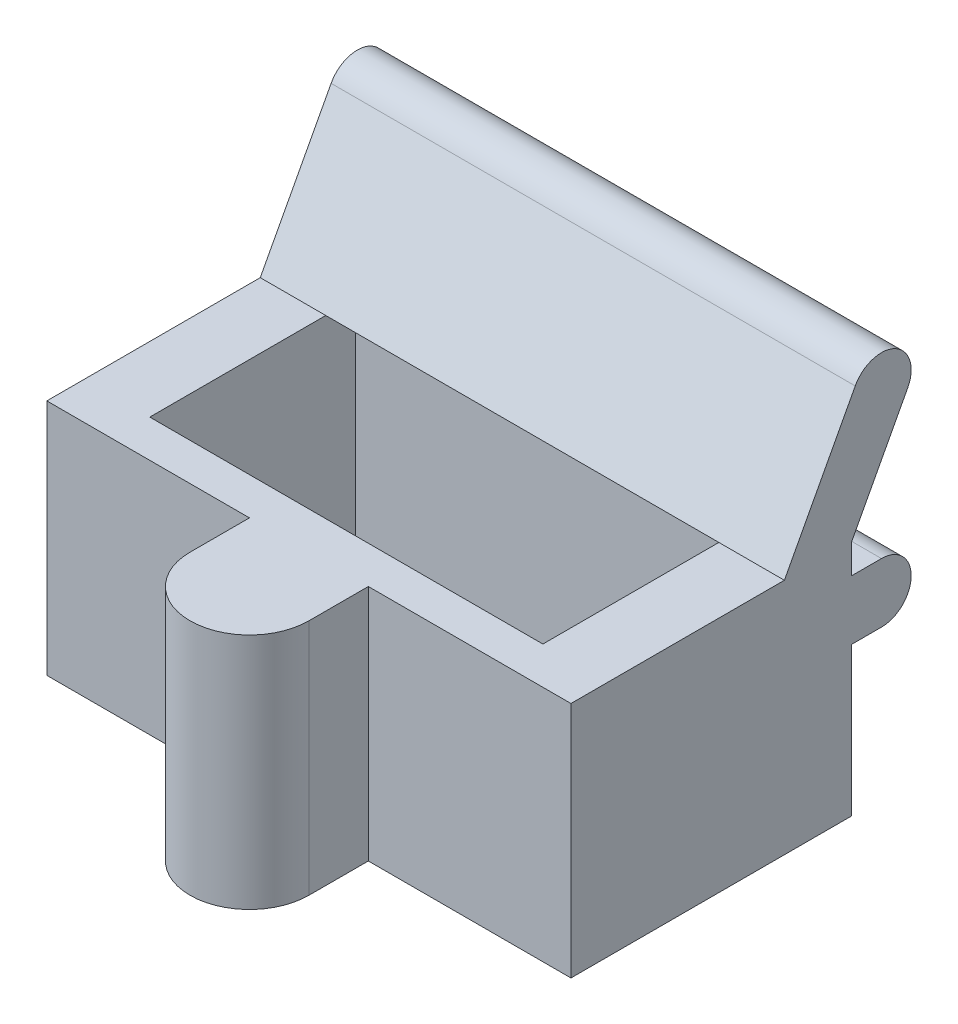
ISO-10303-21;
HEADER;
FILE_DESCRIPTION(('STEP AP214'),'2;1');
FILE_NAME('part.step','',(''),(''),'','','');
FILE_SCHEMA(('AUTOMOTIVE_DESIGN { 1 0 10303 214 1 1 1 1 }'));
ENDSEC;
DATA;
#1=APPLICATION_CONTEXT('core data for automotive mechanical design processes');
#2=APPLICATION_PROTOCOL_DEFINITION('international standard','automotive_design',2000,#1);
#3=PRODUCT_CONTEXT('',#1,'mechanical');
#4=PRODUCT('Part','Part','',(#3));
#5=PRODUCT_RELATED_PRODUCT_CATEGORY('part','',(#4));
#6=PRODUCT_DEFINITION_FORMATION('','',#4);
#7=PRODUCT_DEFINITION_CONTEXT('part definition',#1,'design');
#8=PRODUCT_DEFINITION('design','',#6,#7);
#9=PRODUCT_DEFINITION_SHAPE('','',#8);
#10=(LENGTH_UNIT() NAMED_UNIT(*) SI_UNIT(.MILLI.,.METRE.));
#11=(NAMED_UNIT(*) PLANE_ANGLE_UNIT() SI_UNIT($,.RADIAN.));
#12=(NAMED_UNIT(*) SI_UNIT($,.STERADIAN.) SOLID_ANGLE_UNIT());
#13=UNCERTAINTY_MEASURE_WITH_UNIT(LENGTH_MEASURE(1.E-05),#10,'distance_accuracy_value','');
#14=(GEOMETRIC_REPRESENTATION_CONTEXT(3) GLOBAL_UNCERTAINTY_ASSIGNED_CONTEXT((#13)) GLOBAL_UNIT_ASSIGNED_CONTEXT((#10,
#11,#12)) REPRESENTATION_CONTEXT('',''));
#15=CARTESIAN_POINT('',(0.,0.,0.));
#16=DIRECTION('',(0.,0.,1.));
#17=DIRECTION('',(1.,0.,0.));
#18=AXIS2_PLACEMENT_3D('',#15,#16,#17);
#19=CARTESIAN_POINT('',(0.,25.4,15.));
#20=DIRECTION('',(0.,0.,-1.));
#21=DIRECTION('',(-1.,0.,0.));
#22=AXIS2_PLACEMENT_3D('',#19,#20,#21);
#23=PLANE('',#22);
#24=DIRECTION('',(0.,-1.,0.));
#25=VECTOR('',#24,1.);
#26=CARTESIAN_POINT('',(-6.35,43.3605122421383,15.));
#27=LINE('',#26,#25);
#28=CARTESIAN_POINT('',(-6.35,25.4,15.));
#29=VERTEX_POINT('',#28);
#30=CARTESIAN_POINT('',(-6.35,0.,15.));
#31=VERTEX_POINT('',#30);
#32=EDGE_CURVE('E184',#29,#31,#27,.T.);
#33=ORIENTED_EDGE('',*,*,#32,.F.);
#34=DIRECTION('',(1.,0.,0.));
#35=VECTOR('',#34,1.);
#36=CARTESIAN_POINT('',(0.,25.4,15.));
#37=LINE('',#36,#35);
#38=CARTESIAN_POINT('',(-28.,25.4,15.));
#39=VERTEX_POINT('',#38);
#40=EDGE_CURVE('E194',#39,#29,#37,.T.);
#41=ORIENTED_EDGE('',*,*,#40,.F.);
#42=DIRECTION('',(0.,-1.,0.));
#43=VECTOR('',#42,1.);
#44=CARTESIAN_POINT('',(-28.,25.4,15.));
#45=LINE('',#44,#43);
#46=CARTESIAN_POINT('',(-28.,0.,15.));
#47=VERTEX_POINT('',#46);
#48=EDGE_CURVE('E255',#39,#47,#45,.T.);
#49=ORIENTED_EDGE('',*,*,#48,.T.);
#50=DIRECTION('',(1.,0.,0.));
#51=VECTOR('',#50,1.);
#52=CARTESIAN_POINT('',(0.,0.,15.));
#53=LINE('',#52,#51);
#54=EDGE_CURVE('E196',#47,#31,#53,.T.);
#55=ORIENTED_EDGE('',*,*,#54,.T.);
#56=EDGE_LOOP('',(#33,#41,#49,#55));
#57=FACE_BOUND('',#56,.T.);
#58=ADVANCED_FACE('F39',(#57),#23,.F.);
#59=CARTESIAN_POINT('',(0.,25.4,-15.));
#60=DIRECTION('',(0.,0.,-1.));
#61=DIRECTION('',(-1.,0.,0.));
#62=AXIS2_PLACEMENT_3D('',#59,#60,#61);
#63=PLANE('',#62);
#64=DIRECTION('',(0.,-1.,0.));
#65=VECTOR('',#64,1.);
#66=CARTESIAN_POINT('',(-28.,25.4,-15.));
#67=LINE('',#66,#65);
#68=CARTESIAN_POINT('',(-28.,15.875,-15.));
#69=VERTEX_POINT('',#68);
#70=CARTESIAN_POINT('',(-28.,0.,-15.));
#71=VERTEX_POINT('',#70);
#72=EDGE_CURVE('E256',#69,#71,#67,.T.);
#73=ORIENTED_EDGE('',*,*,#72,.F.);
#74=DIRECTION('',(1.,0.,0.));
#75=VECTOR('',#74,1.);
#76=CARTESIAN_POINT('',(-36.9802561210692,15.875,-15.));
#77=LINE('',#76,#75);
#78=CARTESIAN_POINT('',(28.,15.875,-15.));
#79=VERTEX_POINT('',#78);
#80=EDGE_CURVE('E277',#69,#79,#77,.T.);
#81=ORIENTED_EDGE('',*,*,#80,.T.);
#82=DIRECTION('',(0.,-1.,0.));
#83=VECTOR('',#82,1.);
#84=CARTESIAN_POINT('',(28.,25.4,-15.));
#85=LINE('',#84,#83);
#86=CARTESIAN_POINT('',(28.,0.,-15.));
#87=VERTEX_POINT('',#86);
#88=EDGE_CURVE('E259',#79,#87,#85,.T.);
#89=ORIENTED_EDGE('',*,*,#88,.T.);
#90=DIRECTION('',(1.,0.,0.));
#91=VECTOR('',#90,1.);
#92=CARTESIAN_POINT('',(0.,0.,-15.));
#93=LINE('',#92,#91);
#94=EDGE_CURVE('E224',#71,#87,#93,.T.);
#95=ORIENTED_EDGE('',*,*,#94,.F.);
#96=EDGE_LOOP('',(#73,#81,#89,#95));
#97=FACE_BOUND('',#96,.T.);
#98=ADVANCED_FACE('F274',(#97),#63,.T.);
#99=CARTESIAN_POINT('',(0.,25.4,-11.));
#100=DIRECTION('',(0.,0.,-1.));
#101=DIRECTION('',(-1.,0.,0.));
#102=AXIS2_PLACEMENT_3D('',#99,#100,#101);
#103=PLANE('',#102);
#104=DIRECTION('',(1.,0.,0.));
#105=VECTOR('',#104,1.);
#106=CARTESIAN_POINT('',(0.,0.,-11.));
#107=LINE('',#106,#105);
#108=CARTESIAN_POINT('',(-21.,0.,-11.));
#109=VERTEX_POINT('',#108);
#110=CARTESIAN_POINT('',(21.,0.,-11.));
#111=VERTEX_POINT('',#110);
#112=EDGE_CURVE('E232',#109,#111,#107,.T.);
#113=ORIENTED_EDGE('',*,*,#112,.T.);
#114=DIRECTION('',(0.,-1.,0.));
#115=VECTOR('',#114,1.);
#116=CARTESIAN_POINT('',(21.,25.4,-11.));
#117=LINE('',#116,#115);
#118=CARTESIAN_POINT('',(21.,25.4,-11.));
#119=VERTEX_POINT('',#118);
#120=EDGE_CURVE('E48',#119,#111,#117,.T.);
#121=ORIENTED_EDGE('',*,*,#120,.F.);
#122=DIRECTION('',(1.,0.,0.));
#123=VECTOR('',#122,1.);
#124=CARTESIAN_POINT('',(0.,25.4,-11.));
#125=LINE('',#124,#123);
#126=CARTESIAN_POINT('',(-21.,25.4,-11.));
#127=VERTEX_POINT('',#126);
#128=EDGE_CURVE('E203',#127,#119,#125,.T.);
#129=ORIENTED_EDGE('',*,*,#128,.F.);
#130=DIRECTION('',(0.,-1.,0.));
#131=VECTOR('',#130,1.);
#132=CARTESIAN_POINT('',(-21.,25.4,-11.));
#133=LINE('',#132,#131);
#134=EDGE_CURVE('E245',#127,#109,#133,.T.);
#135=ORIENTED_EDGE('',*,*,#134,.T.);
#136=EDGE_LOOP('',(#113,#121,#129,#135));
#137=FACE_BOUND('',#136,.T.);
#138=ADVANCED_FACE('F377',(#137),#103,.F.);
#139=CARTESIAN_POINT('',(21.,25.4,0.));
#140=DIRECTION('',(1.,0.,0.));
#141=DIRECTION('',(0.,0.,-1.));
#142=AXIS2_PLACEMENT_3D('',#139,#140,#141);
#143=PLANE('',#142);
#144=DIRECTION('',(0.,0.,1.));
#145=VECTOR('',#144,1.);
#146=CARTESIAN_POINT('',(21.,0.,0.));
#147=LINE('',#146,#145);
#148=CARTESIAN_POINT('',(21.,0.,11.));
#149=VERTEX_POINT('',#148);
#150=EDGE_CURVE('E235',#111,#149,#147,.T.);
#151=ORIENTED_EDGE('',*,*,#150,.T.);
#152=DIRECTION('',(0.,-1.,0.));
#153=VECTOR('',#152,1.);
#154=CARTESIAN_POINT('',(21.,25.4,11.));
#155=LINE('',#154,#153);
#156=CARTESIAN_POINT('',(21.,25.4,11.));
#157=VERTEX_POINT('',#156);
#158=EDGE_CURVE('E249',#157,#149,#155,.T.);
#159=ORIENTED_EDGE('',*,*,#158,.F.);
#160=DIRECTION('',(0.,0.,1.));
#161=VECTOR('',#160,1.);
#162=CARTESIAN_POINT('',(21.,25.4,0.));
#163=LINE('',#162,#161);
#164=CARTESIAN_POINT('',(21.,25.4,-7.80333333333333));
#165=VERTEX_POINT('',#164);
#166=EDGE_CURVE('E207',#165,#157,#163,.T.);
#167=ORIENTED_EDGE('',*,*,#166,.F.);
#168=EDGE_CURVE('E212',#119,#165,#163,.T.);
#169=ORIENTED_EDGE('',*,*,#168,.F.);
#170=ORIENTED_EDGE('',*,*,#120,.T.);
#171=EDGE_LOOP('',(#151,#159,#167,#169,#170));
#172=FACE_BOUND('',#171,.T.);
#173=ADVANCED_FACE('F399',(#172),#143,.F.);
#174=CARTESIAN_POINT('',(0.,25.4,11.));
#175=DIRECTION('',(0.,0.,-1.));
#176=DIRECTION('',(-1.,0.,0.));
#177=AXIS2_PLACEMENT_3D('',#174,#175,#176);
#178=PLANE('',#177);
#179=DIRECTION('',(1.,0.,0.));
#180=VECTOR('',#179,1.);
#181=CARTESIAN_POINT('',(0.,0.,11.));
#182=LINE('',#181,#180);
#183=CARTESIAN_POINT('',(-21.,0.,11.));
#184=VERTEX_POINT('',#183);
#185=EDGE_CURVE('E238',#184,#149,#182,.T.);
#186=ORIENTED_EDGE('',*,*,#185,.F.);
#187=DIRECTION('',(0.,-1.,0.));
#188=VECTOR('',#187,1.);
#189=CARTESIAN_POINT('',(-21.,25.4,11.));
#190=LINE('',#189,#188);
#191=CARTESIAN_POINT('',(-21.,25.4,11.));
#192=VERTEX_POINT('',#191);
#193=EDGE_CURVE('E247',#192,#184,#190,.T.);
#194=ORIENTED_EDGE('',*,*,#193,.F.);
#195=DIRECTION('',(1.,0.,0.));
#196=VECTOR('',#195,1.);
#197=CARTESIAN_POINT('',(0.,25.4,11.));
#198=LINE('',#197,#196);
#199=EDGE_CURVE('E215',#192,#157,#198,.T.);
#200=ORIENTED_EDGE('',*,*,#199,.T.);
#201=ORIENTED_EDGE('',*,*,#158,.T.);
#202=EDGE_LOOP('',(#186,#194,#200,#201));
#203=FACE_BOUND('',#202,.T.);
#204=ADVANCED_FACE('F394',(#203),#178,.T.);
#205=CARTESIAN_POINT('',(28.,25.4,0.));
#206=DIRECTION('',(1.,0.,0.));
#207=DIRECTION('',(0.,0.,-1.));
#208=AXIS2_PLACEMENT_3D('',#205,#206,#207);
#209=PLANE('',#208);
#210=DIRECTION('',(0.,0.,1.));
#211=VECTOR('',#210,1.);
#212=CARTESIAN_POINT('',(28.,0.,0.));
#213=LINE('',#212,#211);
#214=CARTESIAN_POINT('',(28.,0.,15.));
#215=VERTEX_POINT('',#214);
#216=EDGE_CURVE('E221',#87,#215,#213,.T.);
#217=ORIENTED_EDGE('',*,*,#216,.F.);
#218=ORIENTED_EDGE('',*,*,#88,.F.);
#219=DIRECTION('',(0.,0.,-1.));
#220=VECTOR('',#219,1.);
#221=CARTESIAN_POINT('',(28.,15.875,-18.175));
#222=LINE('',#221,#220);
#223=CARTESIAN_POINT('',(28.,15.875,-18.175));
#224=VERTEX_POINT('',#223);
#225=EDGE_CURVE('E327',#79,#224,#222,.T.);
#226=ORIENTED_EDGE('',*,*,#225,.T.);
#227=CARTESIAN_POINT('',(28.,19.05,-18.175));
#228=DIRECTION('',(1.,0.,0.));
#229=DIRECTION('',(0.,0.,-1.));
#230=AXIS2_PLACEMENT_3D('',#227,#228,#229);
#231=CIRCLE('',#230,3.175);
#232=CARTESIAN_POINT('',(28.,22.225,-18.175));
#233=VERTEX_POINT('',#232);
#234=EDGE_CURVE('E317',#224,#233,#231,.T.);
#235=ORIENTED_EDGE('',*,*,#234,.T.);
#236=DIRECTION('',(0.,0.,1.));
#237=VECTOR('',#236,1.);
#238=CARTESIAN_POINT('',(28.,22.225,-18.175));
#239=LINE('',#238,#237);
#240=CARTESIAN_POINT('',(28.,22.225,-15.));
#241=VERTEX_POINT('',#240);
#242=EDGE_CURVE('E324',#233,#241,#239,.T.);
#243=ORIENTED_EDGE('',*,*,#242,.T.);
#244=CARTESIAN_POINT('',(28.,25.4,-15.));
#245=VERTEX_POINT('',#244);
#246=EDGE_CURVE('E43',#245,#241,#85,.T.);
#247=ORIENTED_EDGE('',*,*,#246,.F.);
#248=DIRECTION('',(0.,0.88235294117647,-0.470588235294118));
#249=VECTOR('',#248,1.);
#250=CARTESIAN_POINT('',(28.,25.4,-15.));
#251=LINE('',#250,#249);
#252=CARTESIAN_POINT('',(28.,36.6058823529412,-20.9764705882353));
#253=VERTEX_POINT('',#252);
#254=EDGE_CURVE('E296',#245,#253,#251,.T.);
#255=ORIENTED_EDGE('',*,*,#254,.T.);
#256=CARTESIAN_POINT('',(28.,38.1,-18.175));
#257=DIRECTION('',(1.,0.,0.));
#258=DIRECTION('',(0.,0.,-1.));
#259=AXIS2_PLACEMENT_3D('',#256,#257,#258);
#260=CIRCLE('',#259,3.175);
#261=CARTESIAN_POINT('',(28.,39.5941176470588,-15.3735294117647));
#262=VERTEX_POINT('',#261);
#263=EDGE_CURVE('E305',#253,#262,#260,.T.);
#264=ORIENTED_EDGE('',*,*,#263,.T.);
#265=DIRECTION('',(0.,-0.88235294117647,0.470588235294118));
#266=VECTOR('',#265,1.);
#267=CARTESIAN_POINT('',(28.,39.5941176470588,-15.3735294117647));
#268=LINE('',#267,#266);
#269=CARTESIAN_POINT('',(28.,25.4,-7.80333333333333));
#270=VERTEX_POINT('',#269);
#271=EDGE_CURVE('E308',#262,#270,#268,.T.);
#272=ORIENTED_EDGE('',*,*,#271,.T.);
#273=DIRECTION('',(0.,0.,1.));
#274=VECTOR('',#273,1.);
#275=CARTESIAN_POINT('',(28.,25.4,0.));
#276=LINE('',#275,#274);
#277=CARTESIAN_POINT('',(28.,25.4,15.));
#278=VERTEX_POINT('',#277);
#279=EDGE_CURVE('E244',#270,#278,#276,.T.);
#280=ORIENTED_EDGE('',*,*,#279,.T.);
#281=DIRECTION('',(0.,-1.,0.));
#282=VECTOR('',#281,1.);
#283=CARTESIAN_POINT('',(28.,25.4,15.));
#284=LINE('',#283,#282);
#285=EDGE_CURVE('E220',#278,#215,#284,.T.);
#286=ORIENTED_EDGE('',*,*,#285,.T.);
#287=EDGE_LOOP('',(#217,#218,#226,#235,#243,#247,#255,#264,#272,#280,#286));
#288=FACE_BOUND('',#287,.T.);
#289=ADVANCED_FACE('F41',(#288),#209,.T.);
#290=DIRECTION('',(1.,0.,0.));
#291=VECTOR('',#290,1.);
#292=CARTESIAN_POINT('',(-36.9802561210692,22.225,-15.));
#293=LINE('',#292,#291);
#294=CARTESIAN_POINT('',(-28.,22.225,-15.));
#295=VERTEX_POINT('',#294);
#296=EDGE_CURVE('E332',#295,#241,#293,.T.);
#297=ORIENTED_EDGE('',*,*,#296,.F.);
#298=CARTESIAN_POINT('',(-28.,25.4,-15.));
#299=VERTEX_POINT('',#298);
#300=EDGE_CURVE('E257',#299,#295,#67,.T.);
#301=ORIENTED_EDGE('',*,*,#300,.F.);
#302=DIRECTION('',(1.,0.,0.));
#303=VECTOR('',#302,1.);
#304=CARTESIAN_POINT('',(0.,25.4,-15.));
#305=LINE('',#304,#303);
#306=EDGE_CURVE('E337',#299,#245,#305,.T.);
#307=ORIENTED_EDGE('',*,*,#306,.T.);
#308=ORIENTED_EDGE('',*,*,#246,.T.);
#309=EDGE_LOOP('',(#297,#301,#307,#308));
#310=FACE_BOUND('',#309,.T.);
#311=ADVANCED_FACE('F342',(#310),#63,.T.);
#312=CARTESIAN_POINT('',(-28.,25.4,0.));
#313=DIRECTION('',(1.,0.,0.));
#314=DIRECTION('',(0.,0.,-1.));
#315=AXIS2_PLACEMENT_3D('',#312,#313,#314);
#316=PLANE('',#315);
#317=DIRECTION('',(0.,0.,1.));
#318=VECTOR('',#317,1.);
#319=CARTESIAN_POINT('',(-28.,0.,0.));
#320=LINE('',#319,#318);
#321=EDGE_CURVE('E228',#71,#47,#320,.T.);
#322=ORIENTED_EDGE('',*,*,#321,.T.);
#323=ORIENTED_EDGE('',*,*,#48,.F.);
#324=DIRECTION('',(0.,0.,1.));
#325=VECTOR('',#324,1.);
#326=CARTESIAN_POINT('',(-28.,25.4,0.));
#327=LINE('',#326,#325);
#328=CARTESIAN_POINT('',(-28.,25.4,-7.80333333333333));
#329=VERTEX_POINT('',#328);
#330=EDGE_CURVE('E201',#329,#39,#327,.T.);
#331=ORIENTED_EDGE('',*,*,#330,.F.);
#332=DIRECTION('',(0.,0.88235294117647,-0.470588235294118));
#333=VECTOR('',#332,1.);
#334=CARTESIAN_POINT('',(-28.,39.5941176470588,-15.3735294117647));
#335=LINE('',#334,#333);
#336=CARTESIAN_POINT('',(-28.,39.5941176470588,-15.3735294117647));
#337=VERTEX_POINT('',#336);
#338=EDGE_CURVE('E300',#329,#337,#335,.T.);
#339=ORIENTED_EDGE('',*,*,#338,.T.);
#340=CARTESIAN_POINT('',(-28.,38.1,-18.175));
#341=DIRECTION('',(1.,0.,0.));
#342=DIRECTION('',(0.,0.,-1.));
#343=AXIS2_PLACEMENT_3D('',#340,#341,#342);
#344=CIRCLE('',#343,3.175);
#345=CARTESIAN_POINT('',(-28.,36.6058823529412,-20.9764705882353));
#346=VERTEX_POINT('',#345);
#347=EDGE_CURVE('E298',#337,#346,#344,.F.);
#348=ORIENTED_EDGE('',*,*,#347,.T.);
#349=DIRECTION('',(0.,-0.88235294117647,0.470588235294118));
#350=VECTOR('',#349,1.);
#351=CARTESIAN_POINT('',(-28.,25.4,-15.));
#352=LINE('',#351,#350);
#353=EDGE_CURVE('E302',#346,#299,#352,.T.);
#354=ORIENTED_EDGE('',*,*,#353,.T.);
#355=ORIENTED_EDGE('',*,*,#300,.T.);
#356=DIRECTION('',(0.,0.,-1.));
#357=VECTOR('',#356,1.);
#358=CARTESIAN_POINT('',(-28.,22.225,-18.175));
#359=LINE('',#358,#357);
#360=CARTESIAN_POINT('',(-28.,22.225,-18.175));
#361=VERTEX_POINT('',#360);
#362=EDGE_CURVE('E225',#295,#361,#359,.T.);
#363=ORIENTED_EDGE('',*,*,#362,.T.);
#364=CARTESIAN_POINT('',(-28.,19.05,-18.175));
#365=DIRECTION('',(1.,0.,0.));
#366=DIRECTION('',(0.,0.,-1.));
#367=AXIS2_PLACEMENT_3D('',#364,#365,#366);
#368=CIRCLE('',#367,3.175);
#369=CARTESIAN_POINT('',(-28.,15.875,-18.175));
#370=VERTEX_POINT('',#369);
#371=EDGE_CURVE('E319',#361,#370,#368,.F.);
#372=ORIENTED_EDGE('',*,*,#371,.T.);
#373=DIRECTION('',(0.,0.,1.));
#374=VECTOR('',#373,1.);
#375=CARTESIAN_POINT('',(-28.,15.875,-18.175));
#376=LINE('',#375,#374);
#377=EDGE_CURVE('E267',#370,#69,#376,.T.);
#378=ORIENTED_EDGE('',*,*,#377,.T.);
#379=ORIENTED_EDGE('',*,*,#72,.T.);
#380=EDGE_LOOP('',(#322,#323,#331,#339,#348,#354,#355,#363,#372,#378,#379));
#381=FACE_BOUND('',#380,.T.);
#382=ADVANCED_FACE('F265',(#381),#316,.F.);
#383=CARTESIAN_POINT('',(6.35,25.4,15.));
#384=VERTEX_POINT('',#383);
#385=EDGE_CURVE('E204',#384,#278,#37,.T.);
#386=ORIENTED_EDGE('',*,*,#385,.F.);
#387=DIRECTION('',(0.,-1.,0.));
#388=VECTOR('',#387,1.);
#389=CARTESIAN_POINT('',(6.35,43.3605122421383,15.));
#390=LINE('',#389,#388);
#391=CARTESIAN_POINT('',(6.35,0.,15.));
#392=VERTEX_POINT('',#391);
#393=EDGE_CURVE('E197',#384,#392,#390,.T.);
#394=ORIENTED_EDGE('',*,*,#393,.T.);
#395=EDGE_CURVE('E230',#392,#215,#53,.T.);
#396=ORIENTED_EDGE('',*,*,#395,.T.);
#397=ORIENTED_EDGE('',*,*,#285,.F.);
#398=EDGE_LOOP('',(#386,#394,#396,#397));
#399=FACE_BOUND('',#398,.T.);
#400=ADVANCED_FACE('F287',(#399),#23,.F.);
#401=CARTESIAN_POINT('',(-21.,25.4,0.));
#402=DIRECTION('',(1.,0.,0.));
#403=DIRECTION('',(0.,0.,-1.));
#404=AXIS2_PLACEMENT_3D('',#401,#402,#403);
#405=PLANE('',#404);
#406=DIRECTION('',(0.,0.,1.));
#407=VECTOR('',#406,1.);
#408=CARTESIAN_POINT('',(-21.,0.,0.));
#409=LINE('',#408,#407);
#410=EDGE_CURVE('E241',#109,#184,#409,.T.);
#411=ORIENTED_EDGE('',*,*,#410,.F.);
#412=ORIENTED_EDGE('',*,*,#134,.F.);
#413=DIRECTION('',(0.,0.,1.));
#414=VECTOR('',#413,1.);
#415=CARTESIAN_POINT('',(-21.,25.4,0.));
#416=LINE('',#415,#414);
#417=CARTESIAN_POINT('',(-21.,25.4,-7.80333333333333));
#418=VERTEX_POINT('',#417);
#419=EDGE_CURVE('E218',#127,#418,#416,.T.);
#420=ORIENTED_EDGE('',*,*,#419,.T.);
#421=EDGE_CURVE('E66',#418,#192,#416,.T.);
#422=ORIENTED_EDGE('',*,*,#421,.T.);
#423=ORIENTED_EDGE('',*,*,#193,.T.);
#424=EDGE_LOOP('',(#411,#412,#420,#422,#423));
#425=FACE_BOUND('',#424,.T.);
#426=ADVANCED_FACE('F380',(#425),#405,.T.);
#427=CARTESIAN_POINT('',(0.,25.4,0.));
#428=DIRECTION('',(0.,1.,0.));
#429=DIRECTION('',(0.,0.,1.));
#430=AXIS2_PLACEMENT_3D('',#427,#428,#429);
#431=PLANE('',#430);
#432=DIRECTION('',(1.,0.,0.));
#433=VECTOR('',#432,1.);
#434=CARTESIAN_POINT('',(-48.8693028819311,25.4,-7.80333333333332));
#435=LINE('',#434,#433);
#436=EDGE_CURVE('E50',#329,#418,#435,.T.);
#437=ORIENTED_EDGE('',*,*,#436,.F.);
#438=ORIENTED_EDGE('',*,*,#330,.T.);
#439=ORIENTED_EDGE('',*,*,#40,.T.);
#440=DIRECTION('',(0.,0.,-1.));
#441=VECTOR('',#440,1.);
#442=CARTESIAN_POINT('',(-6.35,25.4,21.35));
#443=LINE('',#442,#441);
#444=CARTESIAN_POINT('',(-6.35,25.4,21.35));
#445=VERTEX_POINT('',#444);
#446=EDGE_CURVE('E180',#445,#29,#443,.T.);
#447=ORIENTED_EDGE('',*,*,#446,.F.);
#448=CARTESIAN_POINT('',(0.,25.4,21.35));
#449=DIRECTION('',(0.,1.,0.));
#450=DIRECTION('',(0.,0.,1.));
#451=AXIS2_PLACEMENT_3D('',#448,#449,#450);
#452=CIRCLE('',#451,6.35);
#453=CARTESIAN_POINT('',(6.35,25.4,21.35));
#454=VERTEX_POINT('',#453);
#455=EDGE_CURVE('E297',#454,#445,#452,.F.);
#456=ORIENTED_EDGE('',*,*,#455,.F.);
#457=DIRECTION('',(0.,0.,1.));
#458=VECTOR('',#457,1.);
#459=CARTESIAN_POINT('',(6.35,25.4,21.35));
#460=LINE('',#459,#458);
#461=EDGE_CURVE('E289',#384,#454,#460,.T.);
#462=ORIENTED_EDGE('',*,*,#461,.F.);
#463=ORIENTED_EDGE('',*,*,#385,.T.);
#464=ORIENTED_EDGE('',*,*,#279,.F.);
#465=EDGE_CURVE('E11',#165,#270,#435,.T.);
#466=ORIENTED_EDGE('',*,*,#465,.F.);
#467=ORIENTED_EDGE('',*,*,#166,.T.);
#468=ORIENTED_EDGE('',*,*,#199,.F.);
#469=ORIENTED_EDGE('',*,*,#421,.F.);
#470=EDGE_LOOP('',(#437,#438,#439,#447,#456,#462,#463,#464,#466,#467,#468,#469));
#471=FACE_BOUND('',#470,.T.);
#472=ADVANCED_FACE('F199',(#471),#431,.T.);
#473=CARTESIAN_POINT('',(0.,0.,0.));
#474=DIRECTION('',(0.,1.,0.));
#475=DIRECTION('',(0.,0.,1.));
#476=AXIS2_PLACEMENT_3D('',#473,#474,#475);
#477=PLANE('',#476);
#478=ORIENTED_EDGE('',*,*,#216,.T.);
#479=ORIENTED_EDGE('',*,*,#395,.F.);
#480=DIRECTION('',(0.,0.,1.));
#481=VECTOR('',#480,1.);
#482=CARTESIAN_POINT('',(6.35,0.,21.35));
#483=LINE('',#482,#481);
#484=CARTESIAN_POINT('',(6.35,0.,21.35));
#485=VERTEX_POINT('',#484);
#486=EDGE_CURVE('E58',#392,#485,#483,.T.);
#487=ORIENTED_EDGE('',*,*,#486,.T.);
#488=CARTESIAN_POINT('',(0.,0.,21.35));
#489=DIRECTION('',(0.,-1.,0.));
#490=DIRECTION('',(0.,0.,-1.));
#491=AXIS2_PLACEMENT_3D('',#488,#489,#490);
#492=CIRCLE('',#491,6.35);
#493=CARTESIAN_POINT('',(-6.35,0.,21.35));
#494=VERTEX_POINT('',#493);
#495=EDGE_CURVE('E434',#485,#494,#492,.T.);
#496=ORIENTED_EDGE('',*,*,#495,.T.);
#497=DIRECTION('',(0.,0.,-1.));
#498=VECTOR('',#497,1.);
#499=CARTESIAN_POINT('',(-6.35,0.,21.35));
#500=LINE('',#499,#498);
#501=EDGE_CURVE('E436',#494,#31,#500,.T.);
#502=ORIENTED_EDGE('',*,*,#501,.T.);
#503=ORIENTED_EDGE('',*,*,#54,.F.);
#504=ORIENTED_EDGE('',*,*,#321,.F.);
#505=ORIENTED_EDGE('',*,*,#94,.T.);
#506=EDGE_LOOP('',(#478,#479,#487,#496,#502,#503,#504,#505));
#507=FACE_BOUND('',#506,.T.);
#508=ORIENTED_EDGE('',*,*,#112,.F.);
#509=ORIENTED_EDGE('',*,*,#410,.T.);
#510=ORIENTED_EDGE('',*,*,#185,.T.);
#511=ORIENTED_EDGE('',*,*,#150,.F.);
#512=EDGE_LOOP('',(#508,#509,#510,#511));
#513=FACE_BOUND('',#512,.T.);
#514=ADVANCED_FACE('F272',(#507,#513),#477,.F.);
#515=CARTESIAN_POINT('',(-36.9802561210692,19.05,-18.175));
#516=DIRECTION('',(1.,0.,0.));
#517=DIRECTION('',(0.,0.,-1.));
#518=AXIS2_PLACEMENT_3D('',#515,#516,#517);
#519=CYLINDRICAL_SURFACE('',#518,3.175);
#520=ORIENTED_EDGE('',*,*,#371,.F.);
#521=DIRECTION('',(1.,0.,0.));
#522=VECTOR('',#521,1.);
#523=CARTESIAN_POINT('',(-36.9802561210692,22.225,-18.175));
#524=LINE('',#523,#522);
#525=EDGE_CURVE('E329',#361,#233,#524,.T.);
#526=ORIENTED_EDGE('',*,*,#525,.T.);
#527=ORIENTED_EDGE('',*,*,#234,.F.);
#528=DIRECTION('',(1.,0.,0.));
#529=VECTOR('',#528,1.);
#530=CARTESIAN_POINT('',(-36.9802561210692,15.875,-18.175));
#531=LINE('',#530,#529);
#532=EDGE_CURVE('E320',#370,#224,#531,.T.);
#533=ORIENTED_EDGE('',*,*,#532,.F.);
#534=EDGE_LOOP('',(#520,#526,#527,#533));
#535=FACE_BOUND('',#534,.T.);
#536=ADVANCED_FACE('F357',(#535),#519,.T.);
#537=CARTESIAN_POINT('',(-36.9802561210692,15.875,-18.175));
#538=DIRECTION('',(0.,-1.,0.));
#539=DIRECTION('',(0.,0.,-1.));
#540=AXIS2_PLACEMENT_3D('',#537,#538,#539);
#541=PLANE('',#540);
#542=ORIENTED_EDGE('',*,*,#377,.F.);
#543=ORIENTED_EDGE('',*,*,#532,.T.);
#544=ORIENTED_EDGE('',*,*,#225,.F.);
#545=ORIENTED_EDGE('',*,*,#80,.F.);
#546=EDGE_LOOP('',(#542,#543,#544,#545));
#547=FACE_BOUND('',#546,.T.);
#548=ADVANCED_FACE('F359',(#547),#541,.T.);
#549=CARTESIAN_POINT('',(-36.9802561210692,22.225,-18.175));
#550=DIRECTION('',(0.,1.,0.));
#551=DIRECTION('',(0.,0.,1.));
#552=AXIS2_PLACEMENT_3D('',#549,#550,#551);
#553=PLANE('',#552);
#554=ORIENTED_EDGE('',*,*,#362,.F.);
#555=ORIENTED_EDGE('',*,*,#296,.T.);
#556=ORIENTED_EDGE('',*,*,#242,.F.);
#557=ORIENTED_EDGE('',*,*,#525,.F.);
#558=EDGE_LOOP('',(#554,#555,#556,#557));
#559=FACE_BOUND('',#558,.T.);
#560=ADVANCED_FACE('F353',(#559),#553,.T.);
#561=CARTESIAN_POINT('',(-48.8693028819311,25.4,-7.80333333333332));
#562=DIRECTION('',(0.,-1.,0.));
#563=DIRECTION('',(0.,0.,-1.));
#564=AXIS2_PLACEMENT_3D('',#561,#562,#563);
#565=PLANE('',#564);
#566=ORIENTED_EDGE('',*,*,#128,.T.);
#567=ORIENTED_EDGE('',*,*,#168,.T.);
#568=EDGE_CURVE('E51',#418,#165,#435,.T.);
#569=ORIENTED_EDGE('',*,*,#568,.F.);
#570=ORIENTED_EDGE('',*,*,#419,.F.);
#571=EDGE_LOOP('',(#566,#567,#569,#570));
#572=FACE_BOUND('',#571,.T.);
#573=ADVANCED_FACE('F366',(#572),#565,.T.);
#574=CARTESIAN_POINT('',(-48.8693028819311,39.5941176470588,-15.3735294117647));
#575=DIRECTION('',(0.,0.470588235294118,0.88235294117647));
#576=DIRECTION('',(0.,-0.88235294117647,0.470588235294118));
#577=AXIS2_PLACEMENT_3D('',#574,#575,#576);
#578=PLANE('',#577);
#579=ORIENTED_EDGE('',*,*,#338,.F.);
#580=ORIENTED_EDGE('',*,*,#436,.T.);
#581=ORIENTED_EDGE('',*,*,#568,.T.);
#582=ORIENTED_EDGE('',*,*,#465,.T.);
#583=ORIENTED_EDGE('',*,*,#271,.F.);
#584=DIRECTION('',(1.,0.,0.));
#585=VECTOR('',#584,1.);
#586=CARTESIAN_POINT('',(-48.8693028819311,39.5941176470588,-15.3735294117647));
#587=LINE('',#586,#585);
#588=EDGE_CURVE('E313',#337,#262,#587,.T.);
#589=ORIENTED_EDGE('',*,*,#588,.F.);
#590=EDGE_LOOP('',(#579,#580,#581,#582,#583,#589));
#591=FACE_BOUND('',#590,.T.);
#592=ADVANCED_FACE('F425',(#591),#578,.T.);
#593=CARTESIAN_POINT('',(-48.8693028819311,38.1,-18.175));
#594=DIRECTION('',(1.,0.,0.));
#595=DIRECTION('',(0.,0.,-1.));
#596=AXIS2_PLACEMENT_3D('',#593,#594,#595);
#597=CYLINDRICAL_SURFACE('',#596,3.175);
#598=ORIENTED_EDGE('',*,*,#347,.F.);
#599=ORIENTED_EDGE('',*,*,#588,.T.);
#600=ORIENTED_EDGE('',*,*,#263,.F.);
#601=DIRECTION('',(1.,0.,0.));
#602=VECTOR('',#601,1.);
#603=CARTESIAN_POINT('',(-48.8693028819311,36.6058823529412,-20.9764705882353));
#604=LINE('',#603,#602);
#605=EDGE_CURVE('E310',#346,#253,#604,.T.);
#606=ORIENTED_EDGE('',*,*,#605,.F.);
#607=EDGE_LOOP('',(#598,#599,#600,#606));
#608=FACE_BOUND('',#607,.T.);
#609=ADVANCED_FACE('F429',(#608),#597,.T.);
#610=CARTESIAN_POINT('',(-48.8693028819311,25.4,-15.));
#611=DIRECTION('',(0.,-0.470588235294118,-0.88235294117647));
#612=DIRECTION('',(0.,0.88235294117647,-0.470588235294118));
#613=AXIS2_PLACEMENT_3D('',#610,#611,#612);
#614=PLANE('',#613);
#615=ORIENTED_EDGE('',*,*,#353,.F.);
#616=ORIENTED_EDGE('',*,*,#605,.T.);
#617=ORIENTED_EDGE('',*,*,#254,.F.);
#618=ORIENTED_EDGE('',*,*,#306,.F.);
#619=EDGE_LOOP('',(#615,#616,#617,#618));
#620=FACE_BOUND('',#619,.T.);
#621=ADVANCED_FACE('F345',(#620),#614,.T.);
#622=CARTESIAN_POINT('',(-6.35,43.3605122421383,21.35));
#623=DIRECTION('',(-1.,0.,0.));
#624=DIRECTION('',(0.,0.,1.));
#625=AXIS2_PLACEMENT_3D('',#622,#623,#624);
#626=PLANE('',#625);
#627=DIRECTION('',(0.,-1.,0.));
#628=VECTOR('',#627,1.);
#629=CARTESIAN_POINT('',(-6.35,43.3605122421383,21.35));
#630=LINE('',#629,#628);
#631=EDGE_CURVE('E186',#445,#494,#630,.T.);
#632=ORIENTED_EDGE('',*,*,#631,.F.);
#633=ORIENTED_EDGE('',*,*,#446,.T.);
#634=ORIENTED_EDGE('',*,*,#32,.T.);
#635=ORIENTED_EDGE('',*,*,#501,.F.);
#636=EDGE_LOOP('',(#632,#633,#634,#635));
#637=FACE_BOUND('',#636,.T.);
#638=ADVANCED_FACE('F182',(#637),#626,.T.);
#639=CARTESIAN_POINT('',(6.35,43.3605122421383,21.35));
#640=DIRECTION('',(1.,0.,0.));
#641=DIRECTION('',(0.,0.,-1.));
#642=AXIS2_PLACEMENT_3D('',#639,#640,#641);
#643=PLANE('',#642);
#644=ORIENTED_EDGE('',*,*,#393,.F.);
#645=ORIENTED_EDGE('',*,*,#461,.T.);
#646=DIRECTION('',(0.,-1.,0.));
#647=VECTOR('',#646,1.);
#648=CARTESIAN_POINT('',(6.35,43.3605122421383,21.35));
#649=LINE('',#648,#647);
#650=EDGE_CURVE('E291',#454,#485,#649,.T.);
#651=ORIENTED_EDGE('',*,*,#650,.T.);
#652=ORIENTED_EDGE('',*,*,#486,.F.);
#653=EDGE_LOOP('',(#644,#645,#651,#652));
#654=FACE_BOUND('',#653,.T.);
#655=ADVANCED_FACE('F431',(#654),#643,.T.);
#656=CARTESIAN_POINT('',(0.,43.3605122421383,21.35));
#657=DIRECTION('',(0.,-1.,0.));
#658=DIRECTION('',(0.,0.,-1.));
#659=AXIS2_PLACEMENT_3D('',#656,#657,#658);
#660=CYLINDRICAL_SURFACE('',#659,6.35);
#661=ORIENTED_EDGE('',*,*,#650,.F.);
#662=ORIENTED_EDGE('',*,*,#455,.T.);
#663=ORIENTED_EDGE('',*,*,#631,.T.);
#664=ORIENTED_EDGE('',*,*,#495,.F.);
#665=EDGE_LOOP('',(#661,#662,#663,#664));
#666=FACE_BOUND('',#665,.T.);
#667=ADVANCED_FACE('F435',(#666),#660,.T.);
#668=CLOSED_SHELL('',(#58,#98,#138,#173,#204,#289,#311,#382,#400,#426,#472,#514,#536,#548,#560,
#573,#592,#609,#621,#638,#655,#667));
#669=MANIFOLD_SOLID_BREP('B2',#668);
#670=ADVANCED_BREP_SHAPE_REPRESENTATION('',(#18,#669),#14);
#671=SHAPE_DEFINITION_REPRESENTATION(#9,#670);
ENDSEC;
END-ISO-10303-21;
